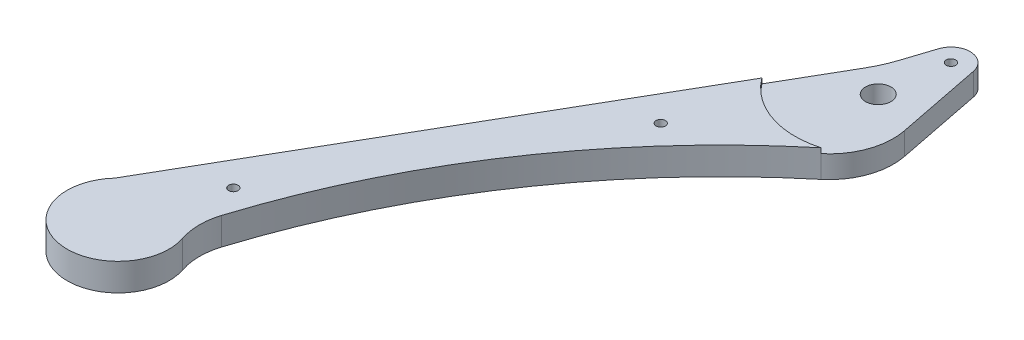
ISO-10303-21;
HEADER;
FILE_DESCRIPTION(('STEP AP214'),'2;1');
FILE_NAME('part.step','',(''),(''),'','','');
FILE_SCHEMA(('AUTOMOTIVE_DESIGN { 1 0 10303 214 1 1 1 1 }'));
ENDSEC;
DATA;
#1=APPLICATION_CONTEXT('core data for automotive mechanical design processes');
#2=APPLICATION_PROTOCOL_DEFINITION('international standard','automotive_design',2000,#1);
#3=PRODUCT_CONTEXT('',#1,'mechanical');
#4=PRODUCT('Part','Part','',(#3));
#5=PRODUCT_RELATED_PRODUCT_CATEGORY('part','',(#4));
#6=PRODUCT_DEFINITION_FORMATION('','',#4);
#7=PRODUCT_DEFINITION_CONTEXT('part definition',#1,'design');
#8=PRODUCT_DEFINITION('design','',#6,#7);
#9=PRODUCT_DEFINITION_SHAPE('','',#8);
#10=(LENGTH_UNIT() NAMED_UNIT(*) SI_UNIT(.MILLI.,.METRE.));
#11=(NAMED_UNIT(*) PLANE_ANGLE_UNIT() SI_UNIT($,.RADIAN.));
#12=(NAMED_UNIT(*) SI_UNIT($,.STERADIAN.) SOLID_ANGLE_UNIT());
#13=UNCERTAINTY_MEASURE_WITH_UNIT(LENGTH_MEASURE(1.E-05),#10,'distance_accuracy_value','');
#14=(GEOMETRIC_REPRESENTATION_CONTEXT(3) GLOBAL_UNCERTAINTY_ASSIGNED_CONTEXT((#13)) GLOBAL_UNIT_ASSIGNED_CONTEXT((#10,
#11,#12)) REPRESENTATION_CONTEXT('',''));
#15=CARTESIAN_POINT('',(0.,0.,0.));
#16=DIRECTION('',(0.,0.,1.));
#17=DIRECTION('',(1.,0.,0.));
#18=AXIS2_PLACEMENT_3D('',#15,#16,#17);
#19=CARTESIAN_POINT('',(0.,22.75,0.));
#20=DIRECTION('',(0.,1.,0.));
#21=DIRECTION('',(0.,0.,1.));
#22=AXIS2_PLACEMENT_3D('',#19,#20,#21);
#23=PLANE('',#22);
#24=CARTESIAN_POINT('',(0.,22.75,220.));
#25=DIRECTION('',(0.,1.,0.));
#26=DIRECTION('',(0.,0.,1.));
#27=AXIS2_PLACEMENT_3D('',#24,#25,#26);
#28=CIRCLE('',#27,5.);
#29=CARTESIAN_POINT('',(0.,22.75,225.));
#30=VERTEX_POINT('',#29);
#31=EDGE_CURVE('E142',#30,#30,#28,.F.);
#32=ORIENTED_EDGE('',*,*,#31,.T.);
#33=EDGE_LOOP('',(#32));
#34=FACE_BOUND('',#33,.T.);
#35=CARTESIAN_POINT('',(3.50836615374225,22.75,195.));
#36=DIRECTION('',(0.,1.,0.));
#37=DIRECTION('',(0.,0.,1.));
#38=AXIS2_PLACEMENT_3D('',#35,#36,#37);
#39=CIRCLE('',#38,1.84999999999997);
#40=CARTESIAN_POINT('',(3.50836615374225,22.75,196.85));
#41=VERTEX_POINT('',#40);
#42=EDGE_CURVE('E148',#41,#41,#39,.T.);
#43=ORIENTED_EDGE('',*,*,#42,.F.);
#44=EDGE_LOOP('',(#43));
#45=FACE_BOUND('',#44,.T.);
#46=DIRECTION('',(-0.5,0.,0.866025403784439));
#47=VECTOR('',#46,1.);
#48=CARTESIAN_POINT('',(83.8626097472654,22.75,48.4181003125282));
#49=LINE('',#48,#47);
#50=CARTESIAN_POINT('',(-11.6473654139671,22.75,213.846229921424));
#51=VERTEX_POINT('',#50);
#52=CARTESIAN_POINT('',(-26.3250465608453,22.75,239.268719405113));
#53=VERTEX_POINT('',#52);
#54=EDGE_CURVE('E140',#51,#53,#49,.T.);
#55=ORIENTED_EDGE('',*,*,#54,.T.);
#56=CARTESIAN_POINT('',(0.,22.75,220.));
#57=DIRECTION('',(0.,1.,0.));
#58=DIRECTION('',(0.,0.,1.));
#59=AXIS2_PLACEMENT_3D('',#56,#57,#58);
#60=CIRCLE('',#59,32.6234827071492);
#61=CARTESIAN_POINT('',(8.9563967031068,22.75,251.369963054493));
#62=VERTEX_POINT('',#61);
#63=EDGE_CURVE('E200',#53,#62,#60,.T.);
#64=ORIENTED_EDGE('',*,*,#63,.T.);
#65=CARTESIAN_POINT('',(-6.99999999999999,22.75,232.124355652982));
#66=DIRECTION('',(0.,1.,0.));
#67=DIRECTION('',(0.,0.,1.));
#68=AXIS2_PLACEMENT_3D('',#65,#66,#67);
#69=CIRCLE('',#68,25.);
#70=CARTESIAN_POINT('',(17.5265672320845,22.75,227.28209380442));
#71=VERTEX_POINT('',#70);
#72=EDGE_CURVE('E175',#71,#62,#69,.F.);
#73=ORIENTED_EDGE('',*,*,#72,.F.);
#74=DIRECTION('',(0.193690473942477,0.,0.98106268928338));
#75=VECTOR('',#74,1.);
#76=CARTESIAN_POINT('',(-26.3196705048328,22.75,5.19627288834587));
#77=LINE('',#76,#75);
#78=CARTESIAN_POINT('',(10.8663363233676,22.75,193.547321445431));
#79=VERTEX_POINT('',#78);
#80=EDGE_CURVE('E221',#79,#71,#77,.T.);
#81=ORIENTED_EDGE('',*,*,#80,.F.);
#82=CARTESIAN_POINT('',(3.50836615374225,22.75,195.));
#83=DIRECTION('',(0.,1.,0.));
#84=DIRECTION('',(0.,0.,1.));
#85=AXIS2_PLACEMENT_3D('',#82,#83,#84);
#86=CIRCLE('',#85,7.50000000000001);
#87=CARTESIAN_POINT('',(-3.62502619831195,22.75,192.683814871032));
#88=VERTEX_POINT('',#87);
#89=EDGE_CURVE('E122',#79,#88,#86,.T.);
#90=ORIENTED_EDGE('',*,*,#89,.T.);
#91=DIRECTION('',(-0.308824683862469,0.,0.951118980273891));
#92=VECTOR('',#91,1.);
#93=CARTESIAN_POINT('',(53.3175300881121,22.75,17.3119974632903));
#94=LINE('',#93,#92);
#95=CARTESIAN_POINT('',(-7.39268658949451,22.75,204.287464114548));
#96=VERTEX_POINT('',#95);
#97=EDGE_CURVE('E114',#88,#96,#94,.T.);
#98=ORIENTED_EDGE('',*,*,#97,.T.);
#99=CARTESIAN_POINT('',(-54.9486356031891,22.75,188.846229921424));
#100=DIRECTION('',(0.,1.,0.));
#101=DIRECTION('',(0.,0.,1.));
#102=AXIS2_PLACEMENT_3D('',#99,#100,#101);
#103=CIRCLE('',#102,50.);
#104=EDGE_CURVE('E118',#96,#51,#103,.F.);
#105=ORIENTED_EDGE('',*,*,#104,.T.);
#106=EDGE_LOOP('',(#55,#64,#73,#81,#90,#98,#105));
#107=FACE_BOUND('',#106,.T.);
#108=ADVANCED_FACE('F37',(#34,#45,#107),#23,.T.);
#109=CARTESIAN_POINT('',(-6.99999999999999,22.75,232.124355652982));
#110=DIRECTION('',(0.,-1.,0.));
#111=DIRECTION('',(0.,0.,-1.));
#112=AXIS2_PLACEMENT_3D('',#109,#110,#111);
#113=CYLINDRICAL_SURFACE('',#112,25.);
#114=CARTESIAN_POINT('',(-6.99999999999999,14.,232.124355652982));
#115=DIRECTION('',(0.,1.,0.));
#116=DIRECTION('',(0.,0.,1.));
#117=AXIS2_PLACEMENT_3D('',#114,#115,#116);
#118=CIRCLE('',#117,25.);
#119=CARTESIAN_POINT('',(17.5265672320845,14.,227.28209380442));
#120=VERTEX_POINT('',#119);
#121=CARTESIAN_POINT('',(8.9563967031068,14.,251.369963054493));
#122=VERTEX_POINT('',#121);
#123=EDGE_CURVE('E151',#120,#122,#118,.F.);
#124=ORIENTED_EDGE('',*,*,#123,.F.);
#125=DIRECTION('',(0.,-1.,0.));
#126=VECTOR('',#125,1.);
#127=CARTESIAN_POINT('',(17.5265672320845,22.75,227.28209380442));
#128=LINE('',#127,#126);
#129=EDGE_CURVE('E11',#71,#120,#128,.T.);
#130=ORIENTED_EDGE('',*,*,#129,.F.);
#131=ORIENTED_EDGE('',*,*,#72,.T.);
#132=DIRECTION('',(0.,-1.,0.));
#133=VECTOR('',#132,1.);
#134=CARTESIAN_POINT('',(8.9563967031068,22.75,251.369963054493));
#135=LINE('',#134,#133);
#136=EDGE_CURVE('E97',#62,#122,#135,.T.);
#137=ORIENTED_EDGE('',*,*,#136,.T.);
#138=EDGE_LOOP('',(#124,#130,#131,#137));
#139=FACE_BOUND('',#138,.T.);
#140=ADVANCED_FACE('F39',(#139),#113,.T.);
#141=CARTESIAN_POINT('',(-26.3196705048328,22.75,5.19627288834587));
#142=DIRECTION('',(0.98106268928338,0.,-0.193690473942477));
#143=DIRECTION('',(-0.193690473942477,0.,-0.98106268928338));
#144=AXIS2_PLACEMENT_3D('',#141,#142,#143);
#145=PLANE('',#144);
#146=DIRECTION('',(0.193690473942477,0.,0.98106268928338));
#147=VECTOR('',#146,1.);
#148=CARTESIAN_POINT('',(-26.3196705048328,14.,5.19627288834587));
#149=LINE('',#148,#147);
#150=CARTESIAN_POINT('',(10.8663363233676,14.,193.547321445431));
#151=VERTEX_POINT('',#150);
#152=EDGE_CURVE('E154',#151,#120,#149,.T.);
#153=ORIENTED_EDGE('',*,*,#152,.F.);
#154=DIRECTION('',(0.,-1.,0.));
#155=VECTOR('',#154,1.);
#156=CARTESIAN_POINT('',(10.8663363233676,22.75,193.547321445431));
#157=LINE('',#156,#155);
#158=EDGE_CURVE('E47',#79,#151,#157,.T.);
#159=ORIENTED_EDGE('',*,*,#158,.F.);
#160=ORIENTED_EDGE('',*,*,#80,.T.);
#161=ORIENTED_EDGE('',*,*,#129,.T.);
#162=EDGE_LOOP('',(#153,#159,#160,#161));
#163=FACE_BOUND('',#162,.T.);
#164=ADVANCED_FACE('F225',(#163),#145,.T.);
#165=CARTESIAN_POINT('',(3.50836615374225,22.75,195.));
#166=DIRECTION('',(0.,-1.,0.));
#167=DIRECTION('',(0.,0.,-1.));
#168=AXIS2_PLACEMENT_3D('',#165,#166,#167);
#169=CYLINDRICAL_SURFACE('',#168,7.50000000000001);
#170=CARTESIAN_POINT('',(3.50836615374225,14.,195.));
#171=DIRECTION('',(0.,1.,0.));
#172=DIRECTION('',(0.,0.,1.));
#173=AXIS2_PLACEMENT_3D('',#170,#171,#172);
#174=CIRCLE('',#173,7.50000000000001);
#175=CARTESIAN_POINT('',(-3.62502619831195,14.,192.683814871032));
#176=VERTEX_POINT('',#175);
#177=EDGE_CURVE('E157',#151,#176,#174,.T.);
#178=ORIENTED_EDGE('',*,*,#177,.T.);
#179=DIRECTION('',(0.,-1.,0.));
#180=VECTOR('',#179,1.);
#181=CARTESIAN_POINT('',(-3.62502619831195,22.75,192.683814871032));
#182=LINE('',#181,#180);
#183=EDGE_CURVE('E134',#88,#176,#182,.T.);
#184=ORIENTED_EDGE('',*,*,#183,.F.);
#185=ORIENTED_EDGE('',*,*,#89,.F.);
#186=ORIENTED_EDGE('',*,*,#158,.T.);
#187=EDGE_LOOP('',(#178,#184,#185,#186));
#188=FACE_BOUND('',#187,.T.);
#189=ADVANCED_FACE('F231',(#188),#169,.T.);
#190=CARTESIAN_POINT('',(53.3175300881121,22.75,17.3119974632903));
#191=DIRECTION('',(0.951118980273891,0.,0.308824683862468));
#192=DIRECTION('',(0.308824683862468,0.,-0.951118980273891));
#193=AXIS2_PLACEMENT_3D('',#190,#191,#192);
#194=PLANE('',#193);
#195=DIRECTION('',(-0.308824683862469,0.,0.951118980273891));
#196=VECTOR('',#195,1.);
#197=CARTESIAN_POINT('',(53.3175300881121,14.,17.3119974632903));
#198=LINE('',#197,#196);
#199=CARTESIAN_POINT('',(-7.39268658949451,14.,204.287464114548));
#200=VERTEX_POINT('',#199);
#201=EDGE_CURVE('E131',#176,#200,#198,.T.);
#202=ORIENTED_EDGE('',*,*,#201,.T.);
#203=DIRECTION('',(0.,-1.,0.));
#204=VECTOR('',#203,1.);
#205=CARTESIAN_POINT('',(-7.39268658949451,22.75,204.287464114548));
#206=LINE('',#205,#204);
#207=EDGE_CURVE('E128',#96,#200,#206,.T.);
#208=ORIENTED_EDGE('',*,*,#207,.F.);
#209=ORIENTED_EDGE('',*,*,#97,.F.);
#210=ORIENTED_EDGE('',*,*,#183,.T.);
#211=EDGE_LOOP('',(#202,#208,#209,#210));
#212=FACE_BOUND('',#211,.T.);
#213=ADVANCED_FACE('F129',(#212),#194,.F.);
#214=CARTESIAN_POINT('',(-54.9486356031891,22.75,188.846229921424));
#215=DIRECTION('',(0.,-1.,0.));
#216=DIRECTION('',(0.,0.,-1.));
#217=AXIS2_PLACEMENT_3D('',#214,#215,#216);
#218=CYLINDRICAL_SURFACE('',#217,50.);
#219=CARTESIAN_POINT('',(-54.9486356031891,14.,188.846229921424));
#220=DIRECTION('',(0.,1.,0.));
#221=DIRECTION('',(0.,0.,1.));
#222=AXIS2_PLACEMENT_3D('',#219,#220,#221);
#223=CIRCLE('',#222,50.);
#224=CARTESIAN_POINT('',(-11.6473654139671,14.,213.846229921424));
#225=VERTEX_POINT('',#224);
#226=EDGE_CURVE('E160',#200,#225,#223,.F.);
#227=ORIENTED_EDGE('',*,*,#226,.T.);
#228=DIRECTION('',(0.,-1.,0.));
#229=VECTOR('',#228,1.);
#230=CARTESIAN_POINT('',(-11.6473654139671,22.75,213.846229921424));
#231=LINE('',#230,#229);
#232=EDGE_CURVE('E135',#51,#225,#231,.T.);
#233=ORIENTED_EDGE('',*,*,#232,.F.);
#234=ORIENTED_EDGE('',*,*,#104,.F.);
#235=ORIENTED_EDGE('',*,*,#207,.T.);
#236=EDGE_LOOP('',(#227,#233,#234,#235));
#237=FACE_BOUND('',#236,.T.);
#238=ADVANCED_FACE('F137',(#237),#218,.F.);
#239=CARTESIAN_POINT('',(83.8626097472654,22.75,48.4181003125282));
#240=DIRECTION('',(0.866025403784439,0.,0.5));
#241=DIRECTION('',(0.5,0.,-0.866025403784439));
#242=AXIS2_PLACEMENT_3D('',#239,#240,#241);
#243=PLANE('',#242);
#244=DIRECTION('',(-0.5,0.,0.866025403784439));
#245=VECTOR('',#244,1.);
#246=CARTESIAN_POINT('',(83.8626097472654,14.,48.4181003125282));
#247=LINE('',#246,#245);
#248=CARTESIAN_POINT('',(-119.210771522047,14.,400.151514335784));
#249=VERTEX_POINT('',#248);
#250=EDGE_CURVE('E162',#225,#249,#247,.T.);
#251=ORIENTED_EDGE('',*,*,#250,.T.);
#252=DIRECTION('',(0.,-1.,0.));
#253=VECTOR('',#252,1.);
#254=CARTESIAN_POINT('',(-119.210771522047,22.75,400.151514335784));
#255=LINE('',#254,#253);
#256=CARTESIAN_POINT('',(-119.210771522047,24.75,400.151514335784));
#257=VERTEX_POINT('',#256);
#258=EDGE_CURVE('E181',#257,#249,#255,.T.);
#259=ORIENTED_EDGE('',*,*,#258,.F.);
#260=DIRECTION('',(0.5,0.,-0.866025403784439));
#261=VECTOR('',#260,1.);
#262=CARTESIAN_POINT('',(83.8626097472654,24.75,48.4181003125283));
#263=LINE('',#262,#261);
#264=CARTESIAN_POINT('',(-26.3250465608453,24.75,239.268719405113));
#265=VERTEX_POINT('',#264);
#266=EDGE_CURVE('E212',#257,#265,#263,.T.);
#267=ORIENTED_EDGE('',*,*,#266,.T.);
#268=DIRECTION('',(0.,-1.,0.));
#269=VECTOR('',#268,1.);
#270=CARTESIAN_POINT('',(-26.3250465608453,24.75,239.268719405113));
#271=LINE('',#270,#269);
#272=EDGE_CURVE('E215',#265,#53,#271,.T.);
#273=ORIENTED_EDGE('',*,*,#272,.T.);
#274=ORIENTED_EDGE('',*,*,#54,.F.);
#275=ORIENTED_EDGE('',*,*,#232,.T.);
#276=EDGE_LOOP('',(#251,#259,#267,#273,#274,#275));
#277=FACE_BOUND('',#276,.T.);
#278=ADVANCED_FACE('F263',(#277),#243,.F.);
#279=CARTESIAN_POINT('',(-104.436031494905,22.75,413.631390341533));
#280=DIRECTION('',(0.,-1.,0.));
#281=DIRECTION('',(0.,0.,-1.));
#282=AXIS2_PLACEMENT_3D('',#279,#280,#281);
#283=CYLINDRICAL_SURFACE('',#282,20.);
#284=CARTESIAN_POINT('',(-104.436031494905,14.,413.631390341533));
#285=DIRECTION('',(0.,1.,0.));
#286=DIRECTION('',(0.,0.,1.));
#287=AXIS2_PLACEMENT_3D('',#284,#285,#286);
#288=CIRCLE('',#287,20.);
#289=CARTESIAN_POINT('',(-85.467754911474,14.,407.290689792347));
#290=VERTEX_POINT('',#289);
#291=EDGE_CURVE('E164',#249,#290,#288,.T.);
#292=ORIENTED_EDGE('',*,*,#291,.T.);
#293=DIRECTION('',(0.,-1.,0.));
#294=VECTOR('',#293,1.);
#295=CARTESIAN_POINT('',(-85.467754911474,22.75,407.290689792347));
#296=LINE('',#295,#294);
#297=CARTESIAN_POINT('',(-85.4677549114741,24.75,407.290689792347));
#298=VERTEX_POINT('',#297);
#299=EDGE_CURVE('E179',#298,#290,#296,.T.);
#300=ORIENTED_EDGE('',*,*,#299,.F.);
#301=CARTESIAN_POINT('',(-104.436031494905,24.75,413.631390341533));
#302=DIRECTION('',(0.,1.,0.));
#303=DIRECTION('',(0.,0.,1.));
#304=AXIS2_PLACEMENT_3D('',#301,#302,#303);
#305=CIRCLE('',#304,20.);
#306=EDGE_CURVE('E201',#257,#298,#305,.T.);
#307=ORIENTED_EDGE('',*,*,#306,.F.);
#308=ORIENTED_EDGE('',*,*,#258,.T.);
#309=EDGE_LOOP('',(#292,#300,#307,#308));
#310=FACE_BOUND('',#309,.T.);
#311=ADVANCED_FACE('F260',(#310),#283,.T.);
#312=CARTESIAN_POINT('',(-61.7574091821848,22.75,399.364814105864));
#313=DIRECTION('',(0.,-1.,0.));
#314=DIRECTION('',(0.,0.,-1.));
#315=AXIS2_PLACEMENT_3D('',#312,#313,#314);
#316=CYLINDRICAL_SURFACE('',#315,25.);
#317=CARTESIAN_POINT('',(-61.7574091821848,14.,399.364814105864));
#318=DIRECTION('',(0.,1.,0.));
#319=DIRECTION('',(0.,0.,1.));
#320=AXIS2_PLACEMENT_3D('',#317,#318,#319);
#321=CIRCLE('',#320,25.);
#322=CARTESIAN_POINT('',(-85.5929152115099,14.,391.823683399796));
#323=VERTEX_POINT('',#322);
#324=EDGE_CURVE('E89',#290,#323,#321,.F.);
#325=ORIENTED_EDGE('',*,*,#324,.T.);
#326=DIRECTION('',(0.,-1.,0.));
#327=VECTOR('',#326,1.);
#328=CARTESIAN_POINT('',(-85.5929152115099,22.75,391.823683399796));
#329=LINE('',#328,#327);
#330=CARTESIAN_POINT('',(-85.5929152115098,24.75,391.823683399796));
#331=VERTEX_POINT('',#330);
#332=EDGE_CURVE('E177',#331,#323,#329,.T.);
#333=ORIENTED_EDGE('',*,*,#332,.F.);
#334=CARTESIAN_POINT('',(-61.7574091821848,24.75,399.364814105864));
#335=DIRECTION('',(0.,1.,0.));
#336=DIRECTION('',(0.,0.,1.));
#337=AXIS2_PLACEMENT_3D('',#334,#335,#336);
#338=CIRCLE('',#337,25.);
#339=EDGE_CURVE('E204',#331,#298,#338,.T.);
#340=ORIENTED_EDGE('',*,*,#339,.T.);
#341=ORIENTED_EDGE('',*,*,#299,.T.);
#342=EDGE_LOOP('',(#325,#333,#340,#341));
#343=FACE_BOUND('',#342,.T.);
#344=ADVANCED_FACE('F253',(#343),#316,.F.);
#345=CARTESIAN_POINT('',(0.,22.75,220.));
#346=DIRECTION('',(0.,-1.,0.));
#347=DIRECTION('',(0.,0.,-1.));
#348=AXIS2_PLACEMENT_3D('',#345,#346,#347);
#349=CYLINDRICAL_SURFACE('',#348,5.);
#350=ORIENTED_EDGE('',*,*,#31,.F.);
#351=EDGE_LOOP('',(#350));
#352=FACE_BOUND('',#351,.T.);
#353=CARTESIAN_POINT('',(0.,14.,220.));
#354=DIRECTION('',(0.,1.,0.));
#355=DIRECTION('',(0.,0.,1.));
#356=AXIS2_PLACEMENT_3D('',#353,#354,#355);
#357=CIRCLE('',#356,5.);
#358=CARTESIAN_POINT('',(0.,14.,225.));
#359=VERTEX_POINT('',#358);
#360=EDGE_CURVE('E169',#359,#359,#357,.F.);
#361=ORIENTED_EDGE('',*,*,#360,.T.);
#362=EDGE_LOOP('',(#361));
#363=FACE_BOUND('',#362,.T.);
#364=ADVANCED_FACE('F250',(#352,#363),#349,.F.);
#365=CARTESIAN_POINT('',(200.43315714039,22.75,482.317251872619));
#366=DIRECTION('',(0.,-1.,0.));
#367=DIRECTION('',(0.,0.,-1.));
#368=AXIS2_PLACEMENT_3D('',#365,#366,#367);
#369=CYLINDRICAL_SURFACE('',#368,300.);
#370=CARTESIAN_POINT('',(200.43315714039,14.,482.317251872619));
#371=DIRECTION('',(0.,1.,0.));
#372=DIRECTION('',(0.,0.,1.));
#373=AXIS2_PLACEMENT_3D('',#370,#371,#372);
#374=CIRCLE('',#373,300.);
#375=EDGE_CURVE('E167',#323,#122,#374,.F.);
#376=ORIENTED_EDGE('',*,*,#375,.T.);
#377=ORIENTED_EDGE('',*,*,#136,.F.);
#378=DIRECTION('',(0.,-1.,0.));
#379=VECTOR('',#378,1.);
#380=CARTESIAN_POINT('',(8.95639670310688,24.75,251.369963054493));
#381=LINE('',#380,#379);
#382=CARTESIAN_POINT('',(8.95639670310688,24.75,251.369963054493));
#383=VERTEX_POINT('',#382);
#384=EDGE_CURVE('E56',#383,#62,#381,.T.);
#385=ORIENTED_EDGE('',*,*,#384,.F.);
#386=CARTESIAN_POINT('',(200.43315714039,24.75,482.317251872619));
#387=DIRECTION('',(0.,1.,0.));
#388=DIRECTION('',(0.,0.,1.));
#389=AXIS2_PLACEMENT_3D('',#386,#387,#388);
#390=CIRCLE('',#389,300.);
#391=EDGE_CURVE('E207',#383,#331,#390,.T.);
#392=ORIENTED_EDGE('',*,*,#391,.T.);
#393=ORIENTED_EDGE('',*,*,#332,.T.);
#394=EDGE_LOOP('',(#376,#377,#385,#392,#393));
#395=FACE_BOUND('',#394,.T.);
#396=ADVANCED_FACE('F248',(#395),#369,.F.);
#397=CARTESIAN_POINT('',(3.50836615374225,22.75,195.));
#398=DIRECTION('',(0.,-1.,0.));
#399=DIRECTION('',(0.,0.,-1.));
#400=AXIS2_PLACEMENT_3D('',#397,#398,#399);
#401=CYLINDRICAL_SURFACE('',#400,1.84999999999997);
#402=ORIENTED_EDGE('',*,*,#42,.T.);
#403=EDGE_LOOP('',(#402));
#404=FACE_BOUND('',#403,.T.);
#405=CARTESIAN_POINT('',(3.50836615374225,14.,195.));
#406=DIRECTION('',(0.,1.,0.));
#407=DIRECTION('',(0.,0.,1.));
#408=AXIS2_PLACEMENT_3D('',#405,#406,#407);
#409=CIRCLE('',#408,1.84999999999997);
#410=CARTESIAN_POINT('',(3.50836615374225,14.,196.85));
#411=VERTEX_POINT('',#410);
#412=EDGE_CURVE('E172',#411,#411,#409,.T.);
#413=ORIENTED_EDGE('',*,*,#412,.F.);
#414=EDGE_LOOP('',(#413));
#415=FACE_BOUND('',#414,.T.);
#416=ADVANCED_FACE('F244',(#404,#415),#401,.F.);
#417=CARTESIAN_POINT('',(0.,14.,0.));
#418=DIRECTION('',(0.,1.,0.));
#419=DIRECTION('',(0.,0.,1.));
#420=AXIS2_PLACEMENT_3D('',#417,#418,#419);
#421=PLANE('',#420);
#422=CARTESIAN_POINT('',(-30.7832154474118,14.,274.503883567911));
#423=DIRECTION('',(0.,1.,0.));
#424=DIRECTION('',(0.,0.,1.));
#425=AXIS2_PLACEMENT_3D('',#422,#423,#424);
#426=CIRCLE('',#425,1.85);
#427=CARTESIAN_POINT('',(-30.7832154474118,14.,276.353883567911));
#428=VERTEX_POINT('',#427);
#429=EDGE_CURVE('E196',#428,#428,#426,.T.);
#430=ORIENTED_EDGE('',*,*,#429,.T.);
#431=EDGE_LOOP('',(#430));
#432=FACE_BOUND('',#431,.T.);
#433=CARTESIAN_POINT('',(-92.6256543864499,14.,380.231076657001));
#434=DIRECTION('',(0.,1.,0.));
#435=DIRECTION('',(0.,0.,1.));
#436=AXIS2_PLACEMENT_3D('',#433,#434,#435);
#437=CIRCLE('',#436,1.85);
#438=CARTESIAN_POINT('',(-92.6256543864499,14.,382.081076657001));
#439=VERTEX_POINT('',#438);
#440=EDGE_CURVE('E188',#439,#439,#437,.T.);
#441=ORIENTED_EDGE('',*,*,#440,.T.);
#442=EDGE_LOOP('',(#441));
#443=FACE_BOUND('',#442,.T.);
#444=ORIENTED_EDGE('',*,*,#123,.T.);
#445=ORIENTED_EDGE('',*,*,#375,.F.);
#446=ORIENTED_EDGE('',*,*,#324,.F.);
#447=ORIENTED_EDGE('',*,*,#291,.F.);
#448=ORIENTED_EDGE('',*,*,#250,.F.);
#449=ORIENTED_EDGE('',*,*,#226,.F.);
#450=ORIENTED_EDGE('',*,*,#201,.F.);
#451=ORIENTED_EDGE('',*,*,#177,.F.);
#452=ORIENTED_EDGE('',*,*,#152,.T.);
#453=EDGE_LOOP('',(#444,#445,#446,#447,#448,#449,#450,#451,#452));
#454=FACE_BOUND('',#453,.T.);
#455=ORIENTED_EDGE('',*,*,#360,.F.);
#456=EDGE_LOOP('',(#455));
#457=FACE_BOUND('',#456,.T.);
#458=ORIENTED_EDGE('',*,*,#412,.T.);
#459=EDGE_LOOP('',(#458));
#460=FACE_BOUND('',#459,.T.);
#461=ADVANCED_FACE('F241',(#432,#443,#454,#457,#460),#421,.F.);
#462=CARTESIAN_POINT('',(0.,24.75,220.));
#463=DIRECTION('',(0.,-1.,0.));
#464=DIRECTION('',(0.,0.,-1.));
#465=AXIS2_PLACEMENT_3D('',#462,#463,#464);
#466=CYLINDRICAL_SURFACE('',#465,32.6234827071492);
#467=ORIENTED_EDGE('',*,*,#63,.F.);
#468=ORIENTED_EDGE('',*,*,#272,.F.);
#469=CARTESIAN_POINT('',(0.,24.75,220.));
#470=DIRECTION('',(0.,1.,0.));
#471=DIRECTION('',(0.,0.,1.));
#472=AXIS2_PLACEMENT_3D('',#469,#470,#471);
#473=CIRCLE('',#472,32.6234827071492);
#474=EDGE_CURVE('E210',#265,#383,#473,.T.);
#475=ORIENTED_EDGE('',*,*,#474,.T.);
#476=ORIENTED_EDGE('',*,*,#384,.T.);
#477=EDGE_LOOP('',(#467,#468,#475,#476));
#478=FACE_BOUND('',#477,.T.);
#479=ADVANCED_FACE('F239',(#478),#466,.F.);
#480=CARTESIAN_POINT('',(-104.436031494905,24.75,413.631390341533));
#481=DIRECTION('',(0.,1.,0.));
#482=DIRECTION('',(0.,0.,1.));
#483=AXIS2_PLACEMENT_3D('',#480,#481,#482);
#484=PLANE('',#483);
#485=CARTESIAN_POINT('',(-30.7832154474118,24.75,274.503883567911));
#486=DIRECTION('',(0.,1.,0.));
#487=DIRECTION('',(0.,0.,1.));
#488=AXIS2_PLACEMENT_3D('',#485,#486,#487);
#489=CIRCLE('',#488,1.85);
#490=CARTESIAN_POINT('',(-30.7832154474118,24.75,276.353883567911));
#491=VERTEX_POINT('',#490);
#492=EDGE_CURVE('E41',#491,#491,#489,.T.);
#493=ORIENTED_EDGE('',*,*,#492,.F.);
#494=EDGE_LOOP('',(#493));
#495=FACE_BOUND('',#494,.T.);
#496=CARTESIAN_POINT('',(-92.6256543864499,24.75,380.231076657001));
#497=DIRECTION('',(0.,1.,0.));
#498=DIRECTION('',(0.,0.,1.));
#499=AXIS2_PLACEMENT_3D('',#496,#497,#498);
#500=CIRCLE('',#499,1.85);
#501=CARTESIAN_POINT('',(-92.6256543864499,24.75,382.081076657001));
#502=VERTEX_POINT('',#501);
#503=EDGE_CURVE('E186',#502,#502,#500,.T.);
#504=ORIENTED_EDGE('',*,*,#503,.F.);
#505=EDGE_LOOP('',(#504));
#506=FACE_BOUND('',#505,.T.);
#507=ORIENTED_EDGE('',*,*,#306,.T.);
#508=ORIENTED_EDGE('',*,*,#339,.F.);
#509=ORIENTED_EDGE('',*,*,#391,.F.);
#510=ORIENTED_EDGE('',*,*,#474,.F.);
#511=ORIENTED_EDGE('',*,*,#266,.F.);
#512=EDGE_LOOP('',(#507,#508,#509,#510,#511));
#513=FACE_BOUND('',#512,.T.);
#514=ADVANCED_FACE('F297',(#495,#506,#513),#484,.T.);
#515=CARTESIAN_POINT('',(-92.6256543864499,0.,380.231076657001));
#516=DIRECTION('',(0.,1.,0.));
#517=DIRECTION('',(0.,0.,1.));
#518=AXIS2_PLACEMENT_3D('',#515,#516,#517);
#519=CYLINDRICAL_SURFACE('',#518,1.85);
#520=ORIENTED_EDGE('',*,*,#503,.T.);
#521=EDGE_LOOP('',(#520));
#522=FACE_BOUND('',#521,.T.);
#523=ORIENTED_EDGE('',*,*,#440,.F.);
#524=EDGE_LOOP('',(#523));
#525=FACE_BOUND('',#524,.T.);
#526=ADVANCED_FACE('F303',(#522,#525),#519,.F.);
#527=CARTESIAN_POINT('',(-30.7832154474118,0.,274.503883567911));
#528=DIRECTION('',(0.,1.,0.));
#529=DIRECTION('',(0.,0.,1.));
#530=AXIS2_PLACEMENT_3D('',#527,#528,#529);
#531=CYLINDRICAL_SURFACE('',#530,1.85);
#532=ORIENTED_EDGE('',*,*,#492,.T.);
#533=EDGE_LOOP('',(#532));
#534=FACE_BOUND('',#533,.T.);
#535=ORIENTED_EDGE('',*,*,#429,.F.);
#536=EDGE_LOOP('',(#535));
#537=FACE_BOUND('',#536,.T.);
#538=ADVANCED_FACE('F308',(#534,#537),#531,.F.);
#539=CLOSED_SHELL('',(#108,#140,#164,#189,#213,#238,#278,#311,#344,#364,#396,#416,#461,#479,
#514,#526,#538));
#540=MANIFOLD_SOLID_BREP('B2',#539);
#541=ADVANCED_BREP_SHAPE_REPRESENTATION('',(#18,#540),#14);
#542=SHAPE_DEFINITION_REPRESENTATION(#9,#541);
ENDSEC;
END-ISO-10303-21;
